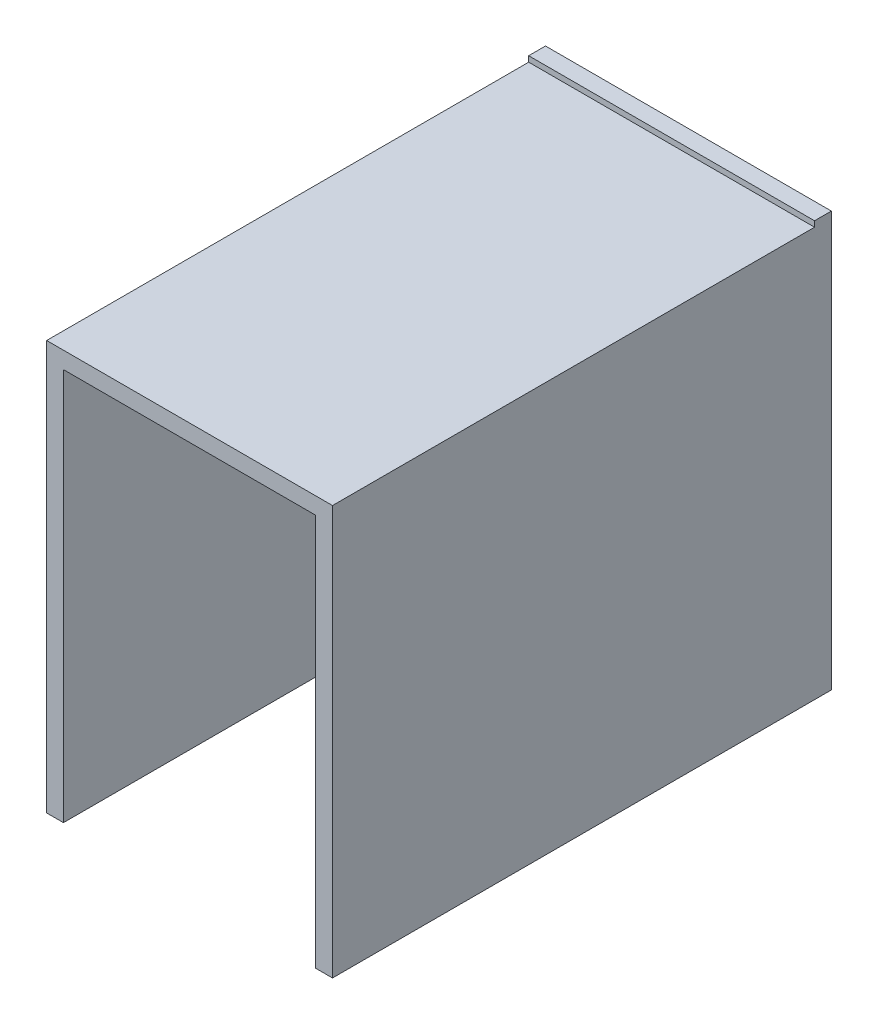
ISO-10303-21;
HEADER;
FILE_DESCRIPTION(('STEP AP214'),'2;1');
FILE_NAME('part.step','',(''),(''),'','','');
FILE_SCHEMA(('AUTOMOTIVE_DESIGN { 1 0 10303 214 1 1 1 1 }'));
ENDSEC;
DATA;
#1=APPLICATION_CONTEXT('core data for automotive mechanical design processes');
#2=APPLICATION_PROTOCOL_DEFINITION('international standard','automotive_design',2000,#1);
#3=PRODUCT_CONTEXT('',#1,'mechanical');
#4=PRODUCT('Part','Part','',(#3));
#5=PRODUCT_RELATED_PRODUCT_CATEGORY('part','',(#4));
#6=PRODUCT_DEFINITION_FORMATION('','',#4);
#7=PRODUCT_DEFINITION_CONTEXT('part definition',#1,'design');
#8=PRODUCT_DEFINITION('design','',#6,#7);
#9=PRODUCT_DEFINITION_SHAPE('','',#8);
#10=(LENGTH_UNIT() NAMED_UNIT(*) SI_UNIT(.MILLI.,.METRE.));
#11=(NAMED_UNIT(*) PLANE_ANGLE_UNIT() SI_UNIT($,.RADIAN.));
#12=(NAMED_UNIT(*) SI_UNIT($,.STERADIAN.) SOLID_ANGLE_UNIT());
#13=UNCERTAINTY_MEASURE_WITH_UNIT(LENGTH_MEASURE(1.E-05),#10,'distance_accuracy_value','');
#14=(GEOMETRIC_REPRESENTATION_CONTEXT(3) GLOBAL_UNCERTAINTY_ASSIGNED_CONTEXT((#13)) GLOBAL_UNIT_ASSIGNED_CONTEXT((#10,
#11,#12)) REPRESENTATION_CONTEXT('',''));
#15=CARTESIAN_POINT('',(0.,0.,0.));
#16=DIRECTION('',(0.,0.,1.));
#17=DIRECTION('',(1.,0.,0.));
#18=AXIS2_PLACEMENT_3D('',#15,#16,#17);
#19=CARTESIAN_POINT('',(0.,0.,0.));
#20=DIRECTION('',(0.,0.,1.));
#21=DIRECTION('',(1.,0.,0.));
#22=AXIS2_PLACEMENT_3D('',#19,#20,#21);
#23=PLANE('',#22);
#24=CARTESIAN_POINT('',(0.,0.0552173561245853,0.));
#25=DIRECTION('',(0.,0.,1.));
#26=DIRECTION('',(1.,0.,0.));
#27=AXIS2_PLACEMENT_3D('',#24,#25,#26);
#28=CIRCLE('',#27,9.90649197063069);
#29=CARTESIAN_POINT('',(9.25,-3.49106001094224,0.));
#30=VERTEX_POINT('',#29);
#31=CARTESIAN_POINT('',(-9.25,-3.49106001094224,0.));
#32=VERTEX_POINT('',#31);
#33=EDGE_CURVE('E277',#30,#32,#28,.T.);
#34=ORIENTED_EDGE('',*,*,#33,.F.);
#35=DIRECTION('',(0.,1.,0.));
#36=VECTOR('',#35,1.);
#37=CARTESIAN_POINT('',(9.25,-14.2558435043668,0.));
#38=LINE('',#37,#36);
#39=CARTESIAN_POINT('',(9.25,-14.2558435043668,0.));
#40=VERTEX_POINT('',#39);
#41=EDGE_CURVE('E285',#40,#30,#38,.T.);
#42=ORIENTED_EDGE('',*,*,#41,.F.);
#43=DIRECTION('',(1.,0.,0.));
#44=VECTOR('',#43,1.);
#45=CARTESIAN_POINT('',(8.,-14.2558435043668,0.));
#46=LINE('',#45,#44);
#47=CARTESIAN_POINT('',(8.,-14.2558435043668,0.));
#48=VERTEX_POINT('',#47);
#49=EDGE_CURVE('E330',#48,#40,#46,.T.);
#50=ORIENTED_EDGE('',*,*,#49,.F.);
#51=DIRECTION('',(0.,-1.,0.));
#52=VECTOR('',#51,1.);
#53=CARTESIAN_POINT('',(8.,-2.87228132326902,0.));
#54=LINE('',#53,#52);
#55=CARTESIAN_POINT('',(8.,-2.87228132326902,0.));
#56=VERTEX_POINT('',#55);
#57=EDGE_CURVE('E326',#56,#48,#54,.T.);
#58=ORIENTED_EDGE('',*,*,#57,.F.);
#59=CARTESIAN_POINT('',(0.,0.,0.));
#60=DIRECTION('',(0.,0.,-1.));
#61=DIRECTION('',(1.,0.,0.));
#62=AXIS2_PLACEMENT_3D('',#59,#60,#61);
#63=CIRCLE('',#62,8.5);
#64=CARTESIAN_POINT('',(-8.,-2.87228132326902,0.));
#65=VERTEX_POINT('',#64);
#66=EDGE_CURVE('E322',#65,#56,#63,.T.);
#67=ORIENTED_EDGE('',*,*,#66,.F.);
#68=DIRECTION('',(0.,1.,0.));
#69=VECTOR('',#68,1.);
#70=CARTESIAN_POINT('',(-8.,-2.87228132326902,0.));
#71=LINE('',#70,#69);
#72=CARTESIAN_POINT('',(-8.,-14.2558435043668,0.));
#73=VERTEX_POINT('',#72);
#74=EDGE_CURVE('E318',#73,#65,#71,.T.);
#75=ORIENTED_EDGE('',*,*,#74,.F.);
#76=DIRECTION('',(1.,0.,0.));
#77=VECTOR('',#76,1.);
#78=CARTESIAN_POINT('',(-9.25,-14.2558435043668,0.));
#79=LINE('',#78,#77);
#80=CARTESIAN_POINT('',(-9.25,-14.2558435043668,0.));
#81=VERTEX_POINT('',#80);
#82=EDGE_CURVE('E314',#81,#73,#79,.T.);
#83=ORIENTED_EDGE('',*,*,#82,.F.);
#84=DIRECTION('',(0.,-1.,0.));
#85=VECTOR('',#84,1.);
#86=CARTESIAN_POINT('',(-9.25,-3.49106001094224,0.));
#87=LINE('',#86,#85);
#88=EDGE_CURVE('E310',#32,#81,#87,.T.);
#89=ORIENTED_EDGE('',*,*,#88,.F.);
#90=EDGE_LOOP('',(#34,#42,#50,#58,#67,#75,#83,#89));
#91=FACE_BOUND('',#90,.T.);
#92=DIRECTION('',(1.,0.,0.));
#93=VECTOR('',#92,1.);
#94=CARTESIAN_POINT('',(-11.25,11.2,0.));
#95=LINE('',#94,#93);
#96=CARTESIAN_POINT('',(-11.25,11.2,0.));
#97=VERTEX_POINT('',#96);
#98=CARTESIAN_POINT('',(11.25,11.2,0.));
#99=VERTEX_POINT('',#98);
#100=EDGE_CURVE('E55',#97,#99,#95,.T.);
#101=ORIENTED_EDGE('',*,*,#100,.F.);
#102=DIRECTION('',(0.,1.,0.));
#103=VECTOR('',#102,1.);
#104=CARTESIAN_POINT('',(-11.25,-23.8,0.));
#105=LINE('',#104,#103);
#106=CARTESIAN_POINT('',(-11.25,-23.8,0.));
#107=VERTEX_POINT('',#106);
#108=EDGE_CURVE('E218',#107,#97,#105,.T.);
#109=ORIENTED_EDGE('',*,*,#108,.F.);
#110=DIRECTION('',(1.,0.,0.));
#111=VECTOR('',#110,1.);
#112=CARTESIAN_POINT('',(-11.25,-23.8,0.));
#113=LINE('',#112,#111);
#114=CARTESIAN_POINT('',(11.25,-23.8,0.));
#115=VERTEX_POINT('',#114);
#116=EDGE_CURVE('E175',#107,#115,#113,.T.);
#117=ORIENTED_EDGE('',*,*,#116,.T.);
#118=DIRECTION('',(0.,-1.,0.));
#119=VECTOR('',#118,1.);
#120=CARTESIAN_POINT('',(11.25,11.2,0.));
#121=LINE('',#120,#119);
#122=EDGE_CURVE('E60',#99,#115,#121,.T.);
#123=ORIENTED_EDGE('',*,*,#122,.F.);
#124=EDGE_LOOP('',(#101,#109,#117,#123));
#125=FACE_BOUND('',#124,.T.);
#126=ADVANCED_FACE('F39',(#91,#125),#23,.T.);
#127=DIRECTION('',(0.,-1.,0.));
#128=VECTOR('',#127,1.);
#129=CARTESIAN_POINT('',(-12.75,-23.8,0.));
#130=LINE('',#129,#128);
#131=CARTESIAN_POINT('',(-12.75,13.2,0.));
#132=VERTEX_POINT('',#131);
#133=CARTESIAN_POINT('',(-12.75,12.7,0.));
#134=VERTEX_POINT('',#133);
#135=EDGE_CURVE('E251',#132,#134,#130,.T.);
#136=ORIENTED_EDGE('',*,*,#135,.T.);
#137=DIRECTION('',(-1.,0.,0.));
#138=VECTOR('',#137,1.);
#139=CARTESIAN_POINT('',(-12.75,12.7,0.));
#140=LINE('',#139,#138);
#141=CARTESIAN_POINT('',(12.75,12.7,0.));
#142=VERTEX_POINT('',#141);
#143=EDGE_CURVE('E194',#142,#134,#140,.T.);
#144=ORIENTED_EDGE('',*,*,#143,.F.);
#145=DIRECTION('',(0.,1.,0.));
#146=VECTOR('',#145,1.);
#147=CARTESIAN_POINT('',(12.75,13.2,0.));
#148=LINE('',#147,#146);
#149=CARTESIAN_POINT('',(12.75,13.2,0.));
#150=VERTEX_POINT('',#149);
#151=EDGE_CURVE('E245',#142,#150,#148,.T.);
#152=ORIENTED_EDGE('',*,*,#151,.T.);
#153=DIRECTION('',(-1.,0.,0.));
#154=VECTOR('',#153,1.);
#155=CARTESIAN_POINT('',(-12.75,13.2,0.));
#156=LINE('',#155,#154);
#157=EDGE_CURVE('E260',#150,#132,#156,.T.);
#158=ORIENTED_EDGE('',*,*,#157,.T.);
#159=EDGE_LOOP('',(#136,#144,#152,#158));
#160=FACE_BOUND('',#159,.T.);
#161=ADVANCED_FACE('F403',(#160),#23,.T.);
#162=CARTESIAN_POINT('',(0.,0.0552173561245853,9.));
#163=DIRECTION('',(0.,0.,-1.));
#164=DIRECTION('',(-1.,0.,0.));
#165=AXIS2_PLACEMENT_3D('',#162,#163,#164);
#166=CYLINDRICAL_SURFACE('',#165,9.90649197063069);
#167=ORIENTED_EDGE('',*,*,#33,.T.);
#168=DIRECTION('',(0.,0.,-1.));
#169=VECTOR('',#168,1.);
#170=CARTESIAN_POINT('',(-9.25,-3.49106001094224,9.));
#171=LINE('',#170,#169);
#172=CARTESIAN_POINT('',(-9.25,-3.49106001094224,9.));
#173=VERTEX_POINT('',#172);
#174=EDGE_CURVE('E11',#173,#32,#171,.T.);
#175=ORIENTED_EDGE('',*,*,#174,.F.);
#176=CARTESIAN_POINT('',(0.,0.0552173561245853,9.));
#177=DIRECTION('',(0.,0.,1.));
#178=DIRECTION('',(1.,0.,0.));
#179=AXIS2_PLACEMENT_3D('',#176,#177,#178);
#180=CIRCLE('',#179,9.90649197063069);
#181=CARTESIAN_POINT('',(9.25,-3.49106001094224,9.));
#182=VERTEX_POINT('',#181);
#183=EDGE_CURVE('E280',#182,#173,#180,.T.);
#184=ORIENTED_EDGE('',*,*,#183,.F.);
#185=DIRECTION('',(0.,0.,-1.));
#186=VECTOR('',#185,1.);
#187=CARTESIAN_POINT('',(9.25,-3.49106001094224,9.));
#188=LINE('',#187,#186);
#189=EDGE_CURVE('E306',#182,#30,#188,.T.);
#190=ORIENTED_EDGE('',*,*,#189,.T.);
#191=EDGE_LOOP('',(#167,#175,#184,#190));
#192=FACE_BOUND('',#191,.T.);
#193=ADVANCED_FACE('F41',(#192),#166,.T.);
#194=CARTESIAN_POINT('',(-9.25,-3.49106001094224,9.));
#195=DIRECTION('',(1.,0.,0.));
#196=DIRECTION('',(0.,1.,0.));
#197=AXIS2_PLACEMENT_3D('',#194,#195,#196);
#198=PLANE('',#197);
#199=ORIENTED_EDGE('',*,*,#88,.T.);
#200=DIRECTION('',(0.,0.,-1.));
#201=VECTOR('',#200,1.);
#202=CARTESIAN_POINT('',(-9.25,-14.2558435043668,9.));
#203=LINE('',#202,#201);
#204=CARTESIAN_POINT('',(-9.25,-14.2558435043668,9.));
#205=VERTEX_POINT('',#204);
#206=EDGE_CURVE('E48',#205,#81,#203,.T.);
#207=ORIENTED_EDGE('',*,*,#206,.F.);
#208=DIRECTION('',(0.,-1.,0.));
#209=VECTOR('',#208,1.);
#210=CARTESIAN_POINT('',(-9.25,-3.49106001094224,9.));
#211=LINE('',#210,#209);
#212=EDGE_CURVE('E284',#173,#205,#211,.T.);
#213=ORIENTED_EDGE('',*,*,#212,.F.);
#214=ORIENTED_EDGE('',*,*,#174,.T.);
#215=EDGE_LOOP('',(#199,#207,#213,#214));
#216=FACE_BOUND('',#215,.T.);
#217=ADVANCED_FACE('F367',(#216),#198,.F.);
#218=CARTESIAN_POINT('',(-9.25,-14.2558435043668,9.));
#219=DIRECTION('',(0.,1.,0.));
#220=DIRECTION('',(0.,0.,1.));
#221=AXIS2_PLACEMENT_3D('',#218,#219,#220);
#222=PLANE('',#221);
#223=ORIENTED_EDGE('',*,*,#82,.T.);
#224=DIRECTION('',(0.,0.,-1.));
#225=VECTOR('',#224,1.);
#226=CARTESIAN_POINT('',(-8.,-14.2558435043668,9.));
#227=LINE('',#226,#225);
#228=CARTESIAN_POINT('',(-8.,-14.2558435043668,9.));
#229=VERTEX_POINT('',#228);
#230=EDGE_CURVE('E356',#229,#73,#227,.T.);
#231=ORIENTED_EDGE('',*,*,#230,.F.);
#232=DIRECTION('',(1.,0.,0.));
#233=VECTOR('',#232,1.);
#234=CARTESIAN_POINT('',(-9.25,-14.2558435043668,9.));
#235=LINE('',#234,#233);
#236=EDGE_CURVE('E288',#205,#229,#235,.T.);
#237=ORIENTED_EDGE('',*,*,#236,.F.);
#238=ORIENTED_EDGE('',*,*,#206,.T.);
#239=EDGE_LOOP('',(#223,#231,#237,#238));
#240=FACE_BOUND('',#239,.T.);
#241=ADVANCED_FACE('F364',(#240),#222,.F.);
#242=CARTESIAN_POINT('',(-8.,-2.87228132326902,9.));
#243=DIRECTION('',(-1.,0.,0.));
#244=DIRECTION('',(0.,0.,1.));
#245=AXIS2_PLACEMENT_3D('',#242,#243,#244);
#246=PLANE('',#245);
#247=ORIENTED_EDGE('',*,*,#74,.T.);
#248=DIRECTION('',(0.,0.,-1.));
#249=VECTOR('',#248,1.);
#250=CARTESIAN_POINT('',(-8.,-2.87228132326902,9.));
#251=LINE('',#250,#249);
#252=CARTESIAN_POINT('',(-8.,-2.87228132326902,9.));
#253=VERTEX_POINT('',#252);
#254=EDGE_CURVE('E352',#253,#65,#251,.T.);
#255=ORIENTED_EDGE('',*,*,#254,.F.);
#256=DIRECTION('',(0.,1.,0.));
#257=VECTOR('',#256,1.);
#258=CARTESIAN_POINT('',(-8.,-2.87228132326902,9.));
#259=LINE('',#258,#257);
#260=EDGE_CURVE('E291',#229,#253,#259,.T.);
#261=ORIENTED_EDGE('',*,*,#260,.F.);
#262=ORIENTED_EDGE('',*,*,#230,.T.);
#263=EDGE_LOOP('',(#247,#255,#261,#262));
#264=FACE_BOUND('',#263,.T.);
#265=ADVANCED_FACE('F372',(#264),#246,.F.);
#266=CARTESIAN_POINT('',(0.,0.,9.));
#267=DIRECTION('',(0.,0.,-1.));
#268=DIRECTION('',(-1.,0.,0.));
#269=AXIS2_PLACEMENT_3D('',#266,#267,#268);
#270=CYLINDRICAL_SURFACE('',#269,8.5);
#271=ORIENTED_EDGE('',*,*,#66,.T.);
#272=DIRECTION('',(0.,0.,-1.));
#273=VECTOR('',#272,1.);
#274=CARTESIAN_POINT('',(8.,-2.87228132326902,9.));
#275=LINE('',#274,#273);
#276=CARTESIAN_POINT('',(8.,-2.87228132326902,9.));
#277=VERTEX_POINT('',#276);
#278=EDGE_CURVE('E348',#277,#56,#275,.T.);
#279=ORIENTED_EDGE('',*,*,#278,.F.);
#280=CARTESIAN_POINT('',(0.,0.,9.));
#281=DIRECTION('',(0.,0.,-1.));
#282=DIRECTION('',(1.,0.,0.));
#283=AXIS2_PLACEMENT_3D('',#280,#281,#282);
#284=CIRCLE('',#283,8.5);
#285=EDGE_CURVE('E294',#253,#277,#284,.T.);
#286=ORIENTED_EDGE('',*,*,#285,.F.);
#287=ORIENTED_EDGE('',*,*,#254,.T.);
#288=EDGE_LOOP('',(#271,#279,#286,#287));
#289=FACE_BOUND('',#288,.T.);
#290=ADVANCED_FACE('F376',(#289),#270,.F.);
#291=CARTESIAN_POINT('',(8.,-2.87228132326902,9.));
#292=DIRECTION('',(1.,0.,0.));
#293=DIRECTION('',(0.,0.,-1.));
#294=AXIS2_PLACEMENT_3D('',#291,#292,#293);
#295=PLANE('',#294);
#296=ORIENTED_EDGE('',*,*,#57,.T.);
#297=DIRECTION('',(0.,0.,-1.));
#298=VECTOR('',#297,1.);
#299=CARTESIAN_POINT('',(8.,-14.2558435043668,9.));
#300=LINE('',#299,#298);
#301=CARTESIAN_POINT('',(8.,-14.2558435043668,9.));
#302=VERTEX_POINT('',#301);
#303=EDGE_CURVE('E344',#302,#48,#300,.T.);
#304=ORIENTED_EDGE('',*,*,#303,.F.);
#305=DIRECTION('',(0.,-1.,0.));
#306=VECTOR('',#305,1.);
#307=CARTESIAN_POINT('',(8.,-2.87228132326902,9.));
#308=LINE('',#307,#306);
#309=EDGE_CURVE('E297',#277,#302,#308,.T.);
#310=ORIENTED_EDGE('',*,*,#309,.F.);
#311=ORIENTED_EDGE('',*,*,#278,.T.);
#312=EDGE_LOOP('',(#296,#304,#310,#311));
#313=FACE_BOUND('',#312,.T.);
#314=ADVANCED_FACE('F393',(#313),#295,.F.);
#315=CARTESIAN_POINT('',(8.,-14.2558435043668,9.));
#316=DIRECTION('',(0.,1.,0.));
#317=DIRECTION('',(0.,0.,1.));
#318=AXIS2_PLACEMENT_3D('',#315,#316,#317);
#319=PLANE('',#318);
#320=ORIENTED_EDGE('',*,*,#49,.T.);
#321=DIRECTION('',(0.,0.,-1.));
#322=VECTOR('',#321,1.);
#323=CARTESIAN_POINT('',(9.25,-14.2558435043668,9.));
#324=LINE('',#323,#322);
#325=CARTESIAN_POINT('',(9.25,-14.2558435043668,9.));
#326=VERTEX_POINT('',#325);
#327=EDGE_CURVE('E340',#326,#40,#324,.T.);
#328=ORIENTED_EDGE('',*,*,#327,.F.);
#329=DIRECTION('',(1.,0.,0.));
#330=VECTOR('',#329,1.);
#331=CARTESIAN_POINT('',(8.,-14.2558435043668,9.));
#332=LINE('',#331,#330);
#333=EDGE_CURVE('E300',#302,#326,#332,.T.);
#334=ORIENTED_EDGE('',*,*,#333,.F.);
#335=ORIENTED_EDGE('',*,*,#303,.T.);
#336=EDGE_LOOP('',(#320,#328,#334,#335));
#337=FACE_BOUND('',#336,.T.);
#338=ADVANCED_FACE('F390',(#337),#319,.F.);
#339=CARTESIAN_POINT('',(9.25,-14.2558435043668,9.));
#340=DIRECTION('',(-1.,0.,0.));
#341=DIRECTION('',(0.,0.,1.));
#342=AXIS2_PLACEMENT_3D('',#339,#340,#341);
#343=PLANE('',#342);
#344=ORIENTED_EDGE('',*,*,#41,.T.);
#345=ORIENTED_EDGE('',*,*,#189,.F.);
#346=DIRECTION('',(0.,1.,0.));
#347=VECTOR('',#346,1.);
#348=CARTESIAN_POINT('',(9.25,-14.2558435043668,9.));
#349=LINE('',#348,#347);
#350=EDGE_CURVE('E303',#326,#182,#349,.T.);
#351=ORIENTED_EDGE('',*,*,#350,.F.);
#352=ORIENTED_EDGE('',*,*,#327,.T.);
#353=EDGE_LOOP('',(#344,#345,#351,#352));
#354=FACE_BOUND('',#353,.T.);
#355=ADVANCED_FACE('F387',(#354),#343,.F.);
#356=CARTESIAN_POINT('',(0.,0.0552173561245853,9.));
#357=DIRECTION('',(0.,0.,1.));
#358=DIRECTION('',(1.,0.,0.));
#359=AXIS2_PLACEMENT_3D('',#356,#357,#358);
#360=PLANE('',#359);
#361=ORIENTED_EDGE('',*,*,#183,.T.);
#362=ORIENTED_EDGE('',*,*,#212,.T.);
#363=ORIENTED_EDGE('',*,*,#236,.T.);
#364=ORIENTED_EDGE('',*,*,#260,.T.);
#365=ORIENTED_EDGE('',*,*,#285,.T.);
#366=ORIENTED_EDGE('',*,*,#309,.T.);
#367=ORIENTED_EDGE('',*,*,#333,.T.);
#368=ORIENTED_EDGE('',*,*,#350,.T.);
#369=EDGE_LOOP('',(#361,#362,#363,#364,#365,#366,#367,#368));
#370=FACE_BOUND('',#369,.T.);
#371=ADVANCED_FACE('F380',(#370),#360,.T.);
#372=CARTESIAN_POINT('',(-11.25,-23.8,-1.5));
#373=DIRECTION('',(0.,-1.,0.));
#374=DIRECTION('',(1.,0.,0.));
#375=AXIS2_PLACEMENT_3D('',#372,#373,#374);
#376=PLANE('',#375);
#377=ORIENTED_EDGE('',*,*,#116,.F.);
#378=DIRECTION('',(0.,0.,-1.));
#379=VECTOR('',#378,1.);
#380=CARTESIAN_POINT('',(-11.25,-23.8,43.));
#381=LINE('',#380,#379);
#382=CARTESIAN_POINT('',(-11.25,-23.8,43.));
#383=VERTEX_POINT('',#382);
#384=EDGE_CURVE('E183',#383,#107,#381,.T.);
#385=ORIENTED_EDGE('',*,*,#384,.F.);
#386=DIRECTION('',(1.,0.,0.));
#387=VECTOR('',#386,1.);
#388=CARTESIAN_POINT('',(-12.75,-23.8,43.));
#389=LINE('',#388,#387);
#390=CARTESIAN_POINT('',(-12.75,-23.8,43.));
#391=VERTEX_POINT('',#390);
#392=EDGE_CURVE('E179',#391,#383,#389,.T.);
#393=ORIENTED_EDGE('',*,*,#392,.F.);
#394=DIRECTION('',(0.,0.,1.));
#395=VECTOR('',#394,1.);
#396=CARTESIAN_POINT('',(-12.75,-23.8,-1.5));
#397=LINE('',#396,#395);
#398=CARTESIAN_POINT('',(-12.75,-23.8,-1.5));
#399=VERTEX_POINT('',#398);
#400=EDGE_CURVE('E164',#399,#391,#397,.T.);
#401=ORIENTED_EDGE('',*,*,#400,.F.);
#402=DIRECTION('',(1.,0.,0.));
#403=VECTOR('',#402,1.);
#404=CARTESIAN_POINT('',(-11.25,-23.8,-1.5));
#405=LINE('',#404,#403);
#406=CARTESIAN_POINT('',(12.75,-23.8,-1.5));
#407=VERTEX_POINT('',#406);
#408=EDGE_CURVE('E274',#399,#407,#405,.T.);
#409=ORIENTED_EDGE('',*,*,#408,.T.);
#410=DIRECTION('',(0.,0.,1.));
#411=VECTOR('',#410,1.);
#412=CARTESIAN_POINT('',(12.75,-23.8,-1.5));
#413=LINE('',#412,#411);
#414=CARTESIAN_POINT('',(12.75,-23.8,43.));
#415=VERTEX_POINT('',#414);
#416=EDGE_CURVE('E257',#407,#415,#413,.T.);
#417=ORIENTED_EDGE('',*,*,#416,.T.);
#418=DIRECTION('',(1.,0.,0.));
#419=VECTOR('',#418,1.);
#420=CARTESIAN_POINT('',(12.75,-23.8,43.));
#421=LINE('',#420,#419);
#422=CARTESIAN_POINT('',(11.25,-23.8,43.));
#423=VERTEX_POINT('',#422);
#424=EDGE_CURVE('E208',#423,#415,#421,.T.);
#425=ORIENTED_EDGE('',*,*,#424,.F.);
#426=DIRECTION('',(0.,0.,-1.));
#427=VECTOR('',#426,1.);
#428=CARTESIAN_POINT('',(11.25,-23.8,43.));
#429=LINE('',#428,#427);
#430=EDGE_CURVE('E231',#423,#115,#429,.T.);
#431=ORIENTED_EDGE('',*,*,#430,.T.);
#432=EDGE_LOOP('',(#377,#385,#393,#401,#409,#417,#425,#431));
#433=FACE_BOUND('',#432,.T.);
#434=ADVANCED_FACE('F181',(#433),#376,.T.);
#435=CARTESIAN_POINT('',(0.,0.,-1.5));
#436=DIRECTION('',(0.,0.,1.));
#437=DIRECTION('',(1.,0.,0.));
#438=AXIS2_PLACEMENT_3D('',#435,#436,#437);
#439=PLANE('',#438);
#440=DIRECTION('',(0.,1.,0.));
#441=VECTOR('',#440,1.);
#442=CARTESIAN_POINT('',(12.75,13.2,-1.5));
#443=LINE('',#442,#441);
#444=CARTESIAN_POINT('',(12.75,13.2,-1.5));
#445=VERTEX_POINT('',#444);
#446=EDGE_CURVE('E246',#407,#445,#443,.T.);
#447=ORIENTED_EDGE('',*,*,#446,.F.);
#448=ORIENTED_EDGE('',*,*,#408,.F.);
#449=DIRECTION('',(0.,-1.,0.));
#450=VECTOR('',#449,1.);
#451=CARTESIAN_POINT('',(-12.75,-23.8,-1.5));
#452=LINE('',#451,#450);
#453=CARTESIAN_POINT('',(-12.75,13.2,-1.5));
#454=VERTEX_POINT('',#453);
#455=EDGE_CURVE('E172',#454,#399,#452,.T.);
#456=ORIENTED_EDGE('',*,*,#455,.F.);
#457=DIRECTION('',(-1.,0.,0.));
#458=VECTOR('',#457,1.);
#459=CARTESIAN_POINT('',(-12.75,13.2,-1.5));
#460=LINE('',#459,#458);
#461=EDGE_CURVE('E250',#445,#454,#460,.T.);
#462=ORIENTED_EDGE('',*,*,#461,.F.);
#463=EDGE_LOOP('',(#447,#448,#456,#462));
#464=FACE_BOUND('',#463,.T.);
#465=ADVANCED_FACE('F411',(#464),#439,.F.);
#466=CARTESIAN_POINT('',(-12.75,-23.8,-1.5));
#467=DIRECTION('',(-1.,0.,0.));
#468=DIRECTION('',(0.,0.,1.));
#469=AXIS2_PLACEMENT_3D('',#466,#467,#468);
#470=PLANE('',#469);
#471=ORIENTED_EDGE('',*,*,#135,.F.);
#472=DIRECTION('',(0.,0.,1.));
#473=VECTOR('',#472,1.);
#474=CARTESIAN_POINT('',(-12.75,13.2,-1.5));
#475=LINE('',#474,#473);
#476=EDGE_CURVE('E176',#454,#132,#475,.T.);
#477=ORIENTED_EDGE('',*,*,#476,.F.);
#478=ORIENTED_EDGE('',*,*,#455,.T.);
#479=ORIENTED_EDGE('',*,*,#400,.T.);
#480=DIRECTION('',(0.,-1.,0.));
#481=VECTOR('',#480,1.);
#482=CARTESIAN_POINT('',(-12.75,12.7,43.));
#483=LINE('',#482,#481);
#484=CARTESIAN_POINT('',(-12.75,12.7,43.));
#485=VERTEX_POINT('',#484);
#486=EDGE_CURVE('E170',#485,#391,#483,.T.);
#487=ORIENTED_EDGE('',*,*,#486,.F.);
#488=DIRECTION('',(0.,0.,-1.));
#489=VECTOR('',#488,1.);
#490=CARTESIAN_POINT('',(-12.75,12.7,43.));
#491=LINE('',#490,#489);
#492=EDGE_CURVE('E217',#485,#134,#491,.T.);
#493=ORIENTED_EDGE('',*,*,#492,.T.);
#494=EDGE_LOOP('',(#471,#477,#478,#479,#487,#493));
#495=FACE_BOUND('',#494,.T.);
#496=ADVANCED_FACE('F167',(#495),#470,.T.);
#497=CARTESIAN_POINT('',(-12.75,13.2,-1.5));
#498=DIRECTION('',(0.,1.,0.));
#499=DIRECTION('',(0.,0.,1.));
#500=AXIS2_PLACEMENT_3D('',#497,#498,#499);
#501=PLANE('',#500);
#502=ORIENTED_EDGE('',*,*,#157,.F.);
#503=DIRECTION('',(0.,0.,1.));
#504=VECTOR('',#503,1.);
#505=CARTESIAN_POINT('',(12.75,13.2,-1.5));
#506=LINE('',#505,#504);
#507=EDGE_CURVE('E268',#445,#150,#506,.T.);
#508=ORIENTED_EDGE('',*,*,#507,.F.);
#509=ORIENTED_EDGE('',*,*,#461,.T.);
#510=ORIENTED_EDGE('',*,*,#476,.T.);
#511=EDGE_LOOP('',(#502,#508,#509,#510));
#512=FACE_BOUND('',#511,.T.);
#513=ADVANCED_FACE('F444',(#512),#501,.T.);
#514=CARTESIAN_POINT('',(12.75,13.2,-1.5));
#515=DIRECTION('',(1.,0.,0.));
#516=DIRECTION('',(0.,1.,0.));
#517=AXIS2_PLACEMENT_3D('',#514,#515,#516);
#518=PLANE('',#517);
#519=ORIENTED_EDGE('',*,*,#151,.F.);
#520=DIRECTION('',(0.,0.,-1.));
#521=VECTOR('',#520,1.);
#522=CARTESIAN_POINT('',(12.75,12.7,43.));
#523=LINE('',#522,#521);
#524=CARTESIAN_POINT('',(12.75,12.7,43.));
#525=VERTEX_POINT('',#524);
#526=EDGE_CURVE('E227',#525,#142,#523,.T.);
#527=ORIENTED_EDGE('',*,*,#526,.F.);
#528=DIRECTION('',(0.,1.,0.));
#529=VECTOR('',#528,1.);
#530=CARTESIAN_POINT('',(12.75,12.7,43.));
#531=LINE('',#530,#529);
#532=EDGE_CURVE('E212',#415,#525,#531,.T.);
#533=ORIENTED_EDGE('',*,*,#532,.F.);
#534=ORIENTED_EDGE('',*,*,#416,.F.);
#535=ORIENTED_EDGE('',*,*,#446,.T.);
#536=ORIENTED_EDGE('',*,*,#507,.T.);
#537=EDGE_LOOP('',(#519,#527,#533,#534,#535,#536));
#538=FACE_BOUND('',#537,.T.);
#539=ADVANCED_FACE('F451',(#538),#518,.T.);
#540=CARTESIAN_POINT('',(-11.25,-23.8,43.));
#541=DIRECTION('',(-1.,0.,0.));
#542=DIRECTION('',(0.,-1.,0.));
#543=AXIS2_PLACEMENT_3D('',#540,#541,#542);
#544=PLANE('',#543);
#545=ORIENTED_EDGE('',*,*,#108,.T.);
#546=DIRECTION('',(0.,0.,-1.));
#547=VECTOR('',#546,1.);
#548=CARTESIAN_POINT('',(-11.25,11.2,43.));
#549=LINE('',#548,#547);
#550=CARTESIAN_POINT('',(-11.25,11.2,43.));
#551=VERTEX_POINT('',#550);
#552=EDGE_CURVE('E239',#551,#97,#549,.T.);
#553=ORIENTED_EDGE('',*,*,#552,.F.);
#554=DIRECTION('',(0.,1.,0.));
#555=VECTOR('',#554,1.);
#556=CARTESIAN_POINT('',(-11.25,-23.8,43.));
#557=LINE('',#556,#555);
#558=EDGE_CURVE('E187',#383,#551,#557,.T.);
#559=ORIENTED_EDGE('',*,*,#558,.F.);
#560=ORIENTED_EDGE('',*,*,#384,.T.);
#561=EDGE_LOOP('',(#545,#553,#559,#560));
#562=FACE_BOUND('',#561,.T.);
#563=ADVANCED_FACE('F459',(#562),#544,.F.);
#564=CARTESIAN_POINT('',(-11.25,11.2,43.));
#565=DIRECTION('',(0.,1.,0.));
#566=DIRECTION('',(0.,0.,1.));
#567=AXIS2_PLACEMENT_3D('',#564,#565,#566);
#568=PLANE('',#567);
#569=ORIENTED_EDGE('',*,*,#100,.T.);
#570=DIRECTION('',(0.,0.,-1.));
#571=VECTOR('',#570,1.);
#572=CARTESIAN_POINT('',(11.25,11.2,43.));
#573=LINE('',#572,#571);
#574=CARTESIAN_POINT('',(11.25,11.2,43.));
#575=VERTEX_POINT('',#574);
#576=EDGE_CURVE('E235',#575,#99,#573,.T.);
#577=ORIENTED_EDGE('',*,*,#576,.F.);
#578=DIRECTION('',(1.,0.,0.));
#579=VECTOR('',#578,1.);
#580=CARTESIAN_POINT('',(-11.25,11.2,43.));
#581=LINE('',#580,#579);
#582=EDGE_CURVE('E202',#551,#575,#581,.T.);
#583=ORIENTED_EDGE('',*,*,#582,.F.);
#584=ORIENTED_EDGE('',*,*,#552,.T.);
#585=EDGE_LOOP('',(#569,#577,#583,#584));
#586=FACE_BOUND('',#585,.T.);
#587=ADVANCED_FACE('F466',(#586),#568,.F.);
#588=CARTESIAN_POINT('',(11.25,11.2,43.));
#589=DIRECTION('',(1.,0.,0.));
#590=DIRECTION('',(0.,1.,0.));
#591=AXIS2_PLACEMENT_3D('',#588,#589,#590);
#592=PLANE('',#591);
#593=ORIENTED_EDGE('',*,*,#122,.T.);
#594=ORIENTED_EDGE('',*,*,#430,.F.);
#595=DIRECTION('',(0.,-1.,0.));
#596=VECTOR('',#595,1.);
#597=CARTESIAN_POINT('',(11.25,11.2,43.));
#598=LINE('',#597,#596);
#599=EDGE_CURVE('E205',#575,#423,#598,.T.);
#600=ORIENTED_EDGE('',*,*,#599,.F.);
#601=ORIENTED_EDGE('',*,*,#576,.T.);
#602=EDGE_LOOP('',(#593,#594,#600,#601));
#603=FACE_BOUND('',#602,.T.);
#604=ADVANCED_FACE('F474',(#603),#592,.F.);
#605=CARTESIAN_POINT('',(-12.75,12.7,43.));
#606=DIRECTION('',(0.,-1.,0.));
#607=DIRECTION('',(0.,0.,-1.));
#608=AXIS2_PLACEMENT_3D('',#605,#606,#607);
#609=PLANE('',#608);
#610=ORIENTED_EDGE('',*,*,#143,.T.);
#611=ORIENTED_EDGE('',*,*,#492,.F.);
#612=DIRECTION('',(-1.,0.,0.));
#613=VECTOR('',#612,1.);
#614=CARTESIAN_POINT('',(-12.75,12.7,43.));
#615=LINE('',#614,#613);
#616=EDGE_CURVE('E191',#525,#485,#615,.T.);
#617=ORIENTED_EDGE('',*,*,#616,.F.);
#618=ORIENTED_EDGE('',*,*,#526,.T.);
#619=EDGE_LOOP('',(#610,#611,#617,#618));
#620=FACE_BOUND('',#619,.T.);
#621=ADVANCED_FACE('F482',(#620),#609,.F.);
#622=CARTESIAN_POINT('',(0.,0.,43.));
#623=DIRECTION('',(0.,0.,1.));
#624=DIRECTION('',(1.,0.,0.));
#625=AXIS2_PLACEMENT_3D('',#622,#623,#624);
#626=PLANE('',#625);
#627=ORIENTED_EDGE('',*,*,#486,.T.);
#628=ORIENTED_EDGE('',*,*,#392,.T.);
#629=ORIENTED_EDGE('',*,*,#558,.T.);
#630=ORIENTED_EDGE('',*,*,#582,.T.);
#631=ORIENTED_EDGE('',*,*,#599,.T.);
#632=ORIENTED_EDGE('',*,*,#424,.T.);
#633=ORIENTED_EDGE('',*,*,#532,.T.);
#634=ORIENTED_EDGE('',*,*,#616,.T.);
#635=EDGE_LOOP('',(#627,#628,#629,#630,#631,#632,#633,#634));
#636=FACE_BOUND('',#635,.T.);
#637=ADVANCED_FACE('F189',(#636),#626,.T.);
#638=CLOSED_SHELL('',(#126,#161,#193,#217,#241,#265,#290,#314,#338,#355,#371,#434,#465,#496,
#513,#539,#563,#587,#604,#621,#637));
#639=MANIFOLD_SOLID_BREP('B2',#638);
#640=ADVANCED_BREP_SHAPE_REPRESENTATION('',(#18,#639),#14);
#641=SHAPE_DEFINITION_REPRESENTATION(#9,#640);
ENDSEC;
END-ISO-10303-21;
